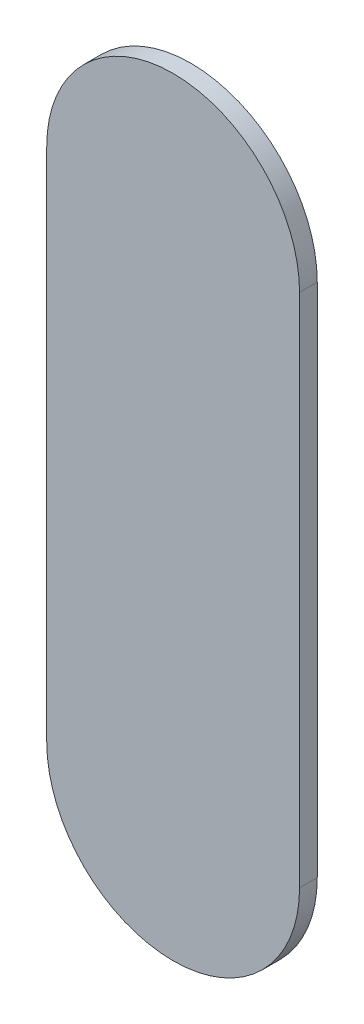
ISO-10303-21;
HEADER;
FILE_DESCRIPTION(('STEP AP214'),'2;1');
FILE_NAME('part.step','',(''),(''),'','','');
FILE_SCHEMA(('AUTOMOTIVE_DESIGN { 1 0 10303 214 1 1 1 1 }'));
ENDSEC;
DATA;
#1=APPLICATION_CONTEXT('core data for automotive mechanical design processes');
#2=APPLICATION_PROTOCOL_DEFINITION('international standard','automotive_design',2000,#1);
#3=PRODUCT_CONTEXT('',#1,'mechanical');
#4=PRODUCT('Part','Part','',(#3));
#5=PRODUCT_RELATED_PRODUCT_CATEGORY('part','',(#4));
#6=PRODUCT_DEFINITION_FORMATION('','',#4);
#7=PRODUCT_DEFINITION_CONTEXT('part definition',#1,'design');
#8=PRODUCT_DEFINITION('design','',#6,#7);
#9=PRODUCT_DEFINITION_SHAPE('','',#8);
#10=(LENGTH_UNIT() NAMED_UNIT(*) SI_UNIT(.MILLI.,.METRE.));
#11=(NAMED_UNIT(*) PLANE_ANGLE_UNIT() SI_UNIT($,.RADIAN.));
#12=(NAMED_UNIT(*) SI_UNIT($,.STERADIAN.) SOLID_ANGLE_UNIT());
#13=UNCERTAINTY_MEASURE_WITH_UNIT(LENGTH_MEASURE(1.E-05),#10,'distance_accuracy_value','');
#14=(GEOMETRIC_REPRESENTATION_CONTEXT(3) GLOBAL_UNCERTAINTY_ASSIGNED_CONTEXT((#13)) GLOBAL_UNIT_ASSIGNED_CONTEXT((#10,
#11,#12)) REPRESENTATION_CONTEXT('',''));
#15=CARTESIAN_POINT('',(0.,0.,0.));
#16=DIRECTION('',(0.,0.,1.));
#17=DIRECTION('',(1.,0.,0.));
#18=AXIS2_PLACEMENT_3D('',#15,#16,#17);
#19=CARTESIAN_POINT('',(132.89,-120.74,1.635));
#20=DIRECTION('',(0.,0.,1.));
#21=DIRECTION('',(1.,0.,0.));
#22=AXIS2_PLACEMENT_3D('',#19,#20,#21);
#23=PLANE('',#22);
#24=DIRECTION('',(0.,-1.,0.));
#25=VECTOR('',#24,1.);
#26=CARTESIAN_POINT('',(132.89,-120.74,1.635));
#27=LINE('',#26,#25);
#28=CARTESIAN_POINT('',(132.89,-120.74,1.635));
#29=VERTEX_POINT('',#28);
#30=CARTESIAN_POINT('',(132.89,-121.76,1.635));
#31=VERTEX_POINT('',#30);
#32=EDGE_CURVE('E79',#29,#31,#27,.T.);
#33=ORIENTED_EDGE('',*,*,#32,.T.);
#34=CARTESIAN_POINT('',(133.14,-121.76,1.635));
#35=DIRECTION('',(0.,0.,1.));
#36=DIRECTION('',(-1.,0.,0.));
#37=AXIS2_PLACEMENT_3D('',#34,#35,#36);
#38=CIRCLE('',#37,0.25);
#39=CARTESIAN_POINT('',(133.39,-121.76,1.635));
#40=VERTEX_POINT('',#39);
#41=EDGE_CURVE('E77',#31,#40,#38,.T.);
#42=ORIENTED_EDGE('',*,*,#41,.T.);
#43=DIRECTION('',(0.,1.,0.));
#44=VECTOR('',#43,1.);
#45=CARTESIAN_POINT('',(133.39,-121.76,1.635));
#46=LINE('',#45,#44);
#47=CARTESIAN_POINT('',(133.39,-120.74,1.635));
#48=VERTEX_POINT('',#47);
#49=EDGE_CURVE('E66',#40,#48,#46,.T.);
#50=ORIENTED_EDGE('',*,*,#49,.T.);
#51=CARTESIAN_POINT('',(133.14,-120.74,1.635));
#52=DIRECTION('',(0.,0.,1.));
#53=DIRECTION('',(1.,0.,0.));
#54=AXIS2_PLACEMENT_3D('',#51,#52,#53);
#55=CIRCLE('',#54,0.25);
#56=EDGE_CURVE('E11',#48,#29,#55,.T.);
#57=ORIENTED_EDGE('',*,*,#56,.T.);
#58=EDGE_LOOP('',(#33,#42,#50,#57));
#59=FACE_BOUND('',#58,.T.);
#60=ADVANCED_FACE('F17',(#59),#23,.T.);
#61=CARTESIAN_POINT('',(132.89,-120.74,1.6));
#62=DIRECTION('',(0.,0.,1.));
#63=DIRECTION('',(1.,0.,0.));
#64=AXIS2_PLACEMENT_3D('',#61,#62,#63);
#65=PLANE('',#64);
#66=CARTESIAN_POINT('',(133.14,-120.74,1.6));
#67=DIRECTION('',(0.,0.,1.));
#68=DIRECTION('',(1.,0.,0.));
#69=AXIS2_PLACEMENT_3D('',#66,#67,#68);
#70=CIRCLE('',#69,0.25);
#71=CARTESIAN_POINT('',(133.39,-120.74,1.6));
#72=VERTEX_POINT('',#71);
#73=CARTESIAN_POINT('',(132.89,-120.74,1.6));
#74=VERTEX_POINT('',#73);
#75=EDGE_CURVE('E20',#72,#74,#70,.T.);
#76=ORIENTED_EDGE('',*,*,#75,.F.);
#77=DIRECTION('',(0.,1.,0.));
#78=VECTOR('',#77,1.);
#79=CARTESIAN_POINT('',(133.39,-121.76,1.6));
#80=LINE('',#79,#78);
#81=CARTESIAN_POINT('',(133.39,-121.76,1.6));
#82=VERTEX_POINT('',#81);
#83=EDGE_CURVE('E84',#82,#72,#80,.T.);
#84=ORIENTED_EDGE('',*,*,#83,.F.);
#85=CARTESIAN_POINT('',(133.14,-121.76,1.6));
#86=DIRECTION('',(0.,0.,1.));
#87=DIRECTION('',(-1.,0.,0.));
#88=AXIS2_PLACEMENT_3D('',#85,#86,#87);
#89=CIRCLE('',#88,0.25);
#90=CARTESIAN_POINT('',(132.89,-121.76,1.6));
#91=VERTEX_POINT('',#90);
#92=EDGE_CURVE('E87',#91,#82,#89,.T.);
#93=ORIENTED_EDGE('',*,*,#92,.F.);
#94=DIRECTION('',(0.,-1.,0.));
#95=VECTOR('',#94,1.);
#96=CARTESIAN_POINT('',(132.89,-120.74,1.6));
#97=LINE('',#96,#95);
#98=EDGE_CURVE('E138',#74,#91,#97,.T.);
#99=ORIENTED_EDGE('',*,*,#98,.F.);
#100=EDGE_LOOP('',(#76,#84,#93,#99));
#101=FACE_BOUND('',#100,.T.);
#102=ADVANCED_FACE('F151',(#101),#65,.F.);
#103=CARTESIAN_POINT('',(133.14,-120.74,1.6));
#104=DIRECTION('',(0.,0.,-1.));
#105=DIRECTION('',(1.,0.,0.));
#106=AXIS2_PLACEMENT_3D('',#103,#104,#105);
#107=CYLINDRICAL_SURFACE('',#106,0.25);
#108=ORIENTED_EDGE('',*,*,#75,.T.);
#109=DIRECTION('',(0.,0.,1.));
#110=VECTOR('',#109,1.);
#111=CARTESIAN_POINT('',(132.89,-120.74,1.6));
#112=LINE('',#111,#110);
#113=EDGE_CURVE('E94',#74,#29,#112,.T.);
#114=ORIENTED_EDGE('',*,*,#113,.T.);
#115=ORIENTED_EDGE('',*,*,#56,.F.);
#116=DIRECTION('',(0.,0.,1.));
#117=VECTOR('',#116,1.);
#118=CARTESIAN_POINT('',(133.39,-120.74,1.6));
#119=LINE('',#118,#117);
#120=EDGE_CURVE('E73',#72,#48,#119,.T.);
#121=ORIENTED_EDGE('',*,*,#120,.F.);
#122=EDGE_LOOP('',(#108,#114,#115,#121));
#123=FACE_BOUND('',#122,.T.);
#124=ADVANCED_FACE('F152',(#123),#107,.T.);
#125=CARTESIAN_POINT('',(133.39,-121.76,1.6));
#126=DIRECTION('',(-1.,0.,0.));
#127=DIRECTION('',(0.,0.,1.));
#128=AXIS2_PLACEMENT_3D('',#125,#126,#127);
#129=PLANE('',#128);
#130=ORIENTED_EDGE('',*,*,#83,.T.);
#131=ORIENTED_EDGE('',*,*,#120,.T.);
#132=ORIENTED_EDGE('',*,*,#49,.F.);
#133=DIRECTION('',(0.,0.,1.));
#134=VECTOR('',#133,1.);
#135=CARTESIAN_POINT('',(133.39,-121.76,1.6));
#136=LINE('',#135,#134);
#137=EDGE_CURVE('E71',#82,#40,#136,.T.);
#138=ORIENTED_EDGE('',*,*,#137,.F.);
#139=EDGE_LOOP('',(#130,#131,#132,#138));
#140=FACE_BOUND('',#139,.T.);
#141=ADVANCED_FACE('F69',(#140),#129,.F.);
#142=CARTESIAN_POINT('',(133.14,-121.76,1.6));
#143=DIRECTION('',(0.,0.,-1.));
#144=DIRECTION('',(-1.,0.,0.));
#145=AXIS2_PLACEMENT_3D('',#142,#143,#144);
#146=CYLINDRICAL_SURFACE('',#145,0.25);
#147=ORIENTED_EDGE('',*,*,#92,.T.);
#148=ORIENTED_EDGE('',*,*,#137,.T.);
#149=ORIENTED_EDGE('',*,*,#41,.F.);
#150=DIRECTION('',(0.,0.,1.));
#151=VECTOR('',#150,1.);
#152=CARTESIAN_POINT('',(132.89,-121.76,1.6));
#153=LINE('',#152,#151);
#154=EDGE_CURVE('E128',#91,#31,#153,.T.);
#155=ORIENTED_EDGE('',*,*,#154,.F.);
#156=EDGE_LOOP('',(#147,#148,#149,#155));
#157=FACE_BOUND('',#156,.T.);
#158=ADVANCED_FACE('F86',(#157),#146,.T.);
#159=CARTESIAN_POINT('',(132.89,-120.74,1.6));
#160=DIRECTION('',(1.,0.,0.));
#161=DIRECTION('',(0.,1.,0.));
#162=AXIS2_PLACEMENT_3D('',#159,#160,#161);
#163=PLANE('',#162);
#164=ORIENTED_EDGE('',*,*,#98,.T.);
#165=ORIENTED_EDGE('',*,*,#154,.T.);
#166=ORIENTED_EDGE('',*,*,#32,.F.);
#167=ORIENTED_EDGE('',*,*,#113,.F.);
#168=EDGE_LOOP('',(#164,#165,#166,#167));
#169=FACE_BOUND('',#168,.T.);
#170=ADVANCED_FACE('F149',(#169),#163,.F.);
#171=CLOSED_SHELL('',(#60,#102,#124,#141,#158,#170));
#172=MANIFOLD_SOLID_BREP('B1',#171);
#173=ADVANCED_BREP_SHAPE_REPRESENTATION('',(#18,#172),#14);
#174=SHAPE_DEFINITION_REPRESENTATION(#9,#173);
ENDSEC;
END-ISO-10303-21;
